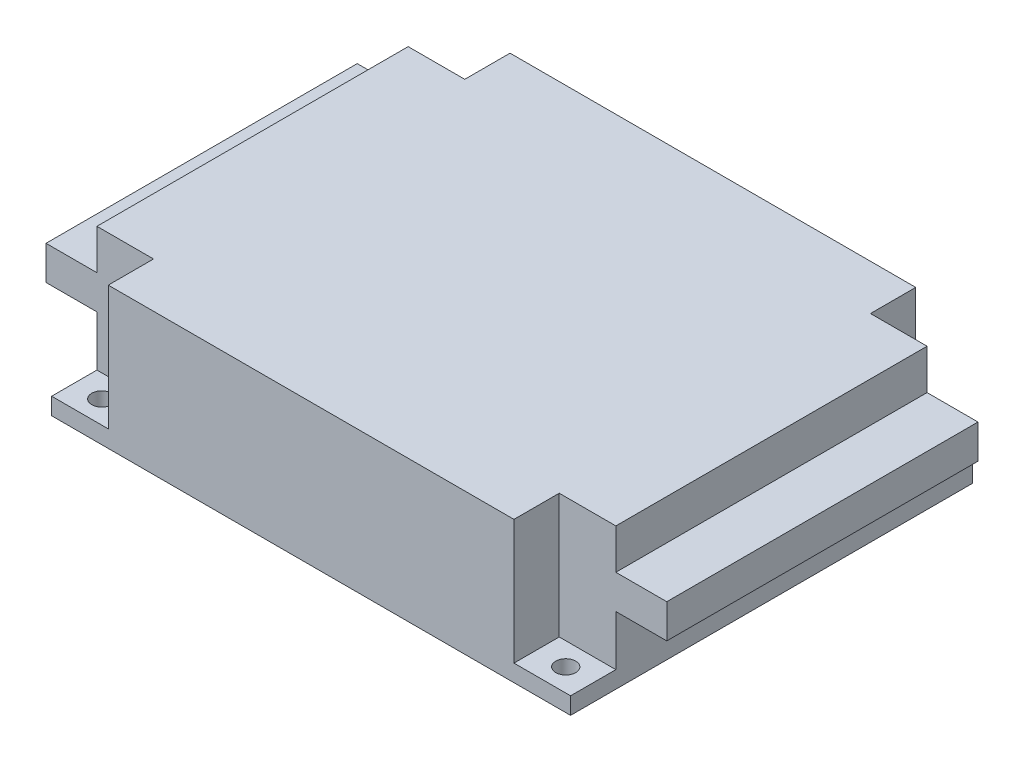
ISO-10303-21;
HEADER;
FILE_DESCRIPTION(('STEP AP214'),'2;1');
FILE_NAME('part.step','',(''),(''),'','','');
FILE_SCHEMA(('AUTOMOTIVE_DESIGN { 1 0 10303 214 1 1 1 1 }'));
ENDSEC;
DATA;
#1=APPLICATION_CONTEXT('core data for automotive mechanical design processes');
#2=APPLICATION_PROTOCOL_DEFINITION('international standard','automotive_design',2000,#1);
#3=PRODUCT_CONTEXT('',#1,'mechanical');
#4=PRODUCT('Part','Part','',(#3));
#5=PRODUCT_RELATED_PRODUCT_CATEGORY('part','',(#4));
#6=PRODUCT_DEFINITION_FORMATION('','',#4);
#7=PRODUCT_DEFINITION_CONTEXT('part definition',#1,'design');
#8=PRODUCT_DEFINITION('design','',#6,#7);
#9=PRODUCT_DEFINITION_SHAPE('','',#8);
#10=(LENGTH_UNIT() NAMED_UNIT(*) SI_UNIT(.MILLI.,.METRE.));
#11=(NAMED_UNIT(*) PLANE_ANGLE_UNIT() SI_UNIT($,.RADIAN.));
#12=(NAMED_UNIT(*) SI_UNIT($,.STERADIAN.) SOLID_ANGLE_UNIT());
#13=UNCERTAINTY_MEASURE_WITH_UNIT(LENGTH_MEASURE(1.E-05),#10,'distance_accuracy_value','');
#14=(GEOMETRIC_REPRESENTATION_CONTEXT(3) GLOBAL_UNCERTAINTY_ASSIGNED_CONTEXT((#13)) GLOBAL_UNIT_ASSIGNED_CONTEXT((#10,
#11,#12)) REPRESENTATION_CONTEXT('',''));
#15=CARTESIAN_POINT('',(0.,0.,0.));
#16=DIRECTION('',(0.,0.,1.));
#17=DIRECTION('',(1.,0.,0.));
#18=AXIS2_PLACEMENT_3D('',#15,#16,#17);
#19=CARTESIAN_POINT('',(0.,0.,0.));
#20=DIRECTION('',(0.,1.,0.));
#21=DIRECTION('',(0.,0.,1.));
#22=AXIS2_PLACEMENT_3D('',#19,#20,#21);
#23=PLANE('',#22);
#24=CARTESIAN_POINT('',(86.8463240658172,0.,-55.9996014014068));
#25=DIRECTION('',(0.,-1.,0.));
#26=DIRECTION('',(0.,0.,-1.));
#27=AXIS2_PLACEMENT_3D('',#24,#25,#26);
#28=CIRCLE('',#27,1.76559838278757);
#29=CARTESIAN_POINT('',(86.8463240658172,0.,-57.7651997841944));
#30=VERTEX_POINT('',#29);
#31=EDGE_CURVE('E713',#30,#30,#28,.T.);
#32=ORIENTED_EDGE('',*,*,#31,.F.);
#33=EDGE_LOOP('',(#32));
#34=FACE_BOUND('',#33,.T.);
#35=CARTESIAN_POINT('',(86.8463240658172,0.,6.99960140140685));
#36=DIRECTION('',(0.,-1.,0.));
#37=DIRECTION('',(0.,0.,-1.));
#38=AXIS2_PLACEMENT_3D('',#35,#36,#37);
#39=CIRCLE('',#38,1.76559838278757);
#40=CARTESIAN_POINT('',(86.8463240658172,0.,5.23400301861927));
#41=VERTEX_POINT('',#40);
#42=EDGE_CURVE('E363',#41,#41,#39,.T.);
#43=ORIENTED_EDGE('',*,*,#42,.F.);
#44=EDGE_LOOP('',(#43));
#45=FACE_BOUND('',#44,.T.);
#46=CARTESIAN_POINT('',(4.85367593418285,0.,6.99960140140685));
#47=DIRECTION('',(0.,-1.,0.));
#48=DIRECTION('',(0.,0.,-1.));
#49=AXIS2_PLACEMENT_3D('',#46,#47,#48);
#50=CIRCLE('',#49,1.76559838278757);
#51=CARTESIAN_POINT('',(4.85367593418285,0.,5.23400301861927));
#52=VERTEX_POINT('',#51);
#53=EDGE_CURVE('E352',#52,#52,#50,.T.);
#54=ORIENTED_EDGE('',*,*,#53,.F.);
#55=EDGE_LOOP('',(#54));
#56=FACE_BOUND('',#55,.T.);
#57=DIRECTION('',(0.,0.,-1.));
#58=VECTOR('',#57,1.);
#59=CARTESIAN_POINT('',(91.7,0.,11.));
#60=LINE('',#59,#58);
#61=CARTESIAN_POINT('',(91.7,0.,11.));
#62=VERTEX_POINT('',#61);
#63=CARTESIAN_POINT('',(91.7,0.,-60.));
#64=VERTEX_POINT('',#63);
#65=EDGE_CURVE('E317',#62,#64,#60,.T.);
#66=ORIENTED_EDGE('',*,*,#65,.F.);
#67=DIRECTION('',(1.,0.,0.));
#68=VECTOR('',#67,1.);
#69=CARTESIAN_POINT('',(0.,0.,11.));
#70=LINE('',#69,#68);
#71=CARTESIAN_POINT('',(0.,0.,11.));
#72=VERTEX_POINT('',#71);
#73=EDGE_CURVE('E327',#72,#62,#70,.T.);
#74=ORIENTED_EDGE('',*,*,#73,.F.);
#75=DIRECTION('',(0.,0.,1.));
#76=VECTOR('',#75,1.);
#77=CARTESIAN_POINT('',(0.,0.,-60.));
#78=LINE('',#77,#76);
#79=CARTESIAN_POINT('',(0.,0.,-60.));
#80=VERTEX_POINT('',#79);
#81=EDGE_CURVE('E324',#80,#72,#78,.T.);
#82=ORIENTED_EDGE('',*,*,#81,.F.);
#83=DIRECTION('',(-1.,0.,0.));
#84=VECTOR('',#83,1.);
#85=CARTESIAN_POINT('',(91.7,0.,-60.));
#86=LINE('',#85,#84);
#87=EDGE_CURVE('E320',#64,#80,#86,.T.);
#88=ORIENTED_EDGE('',*,*,#87,.F.);
#89=EDGE_LOOP('',(#66,#74,#82,#88));
#90=FACE_BOUND('',#89,.T.);
#91=CARTESIAN_POINT('',(4.85367593418285,0.,-55.9996014014068));
#92=DIRECTION('',(0.,-1.,0.));
#93=DIRECTION('',(0.,0.,-1.));
#94=AXIS2_PLACEMENT_3D('',#91,#92,#93);
#95=CIRCLE('',#94,1.76559838278757);
#96=CARTESIAN_POINT('',(4.85367593418285,0.,-57.7651997841944));
#97=VERTEX_POINT('',#96);
#98=EDGE_CURVE('E349',#97,#97,#95,.T.);
#99=ORIENTED_EDGE('',*,*,#98,.F.);
#100=EDGE_LOOP('',(#99));
#101=FACE_BOUND('',#100,.T.);
#102=ADVANCED_FACE('F36',(#34,#45,#56,#90,#101),#23,.F.);
#103=CARTESIAN_POINT('',(91.7,0.,11.));
#104=DIRECTION('',(1.,0.,0.));
#105=DIRECTION('',(0.,0.,-1.));
#106=AXIS2_PLACEMENT_3D('',#103,#104,#105);
#107=PLANE('',#106);
#108=DIRECTION('',(0.,1.,0.));
#109=VECTOR('',#108,1.);
#110=CARTESIAN_POINT('',(91.7,3.,2.99972961709421));
#111=LINE('',#110,#109);
#112=CARTESIAN_POINT('',(91.7,3.,2.99972961709421));
#113=VERTEX_POINT('',#112);
#114=CARTESIAN_POINT('',(91.7,11.9,2.99972961709421));
#115=VERTEX_POINT('',#114);
#116=EDGE_CURVE('E389',#113,#115,#111,.T.);
#117=ORIENTED_EDGE('',*,*,#116,.F.);
#118=DIRECTION('',(0.,0.,-1.));
#119=VECTOR('',#118,1.);
#120=CARTESIAN_POINT('',(91.7,3.,11.));
#121=LINE('',#120,#119);
#122=CARTESIAN_POINT('',(91.7,3.,11.));
#123=VERTEX_POINT('',#122);
#124=EDGE_CURVE('E384',#123,#113,#121,.T.);
#125=ORIENTED_EDGE('',*,*,#124,.F.);
#126=DIRECTION('',(0.,1.,0.));
#127=VECTOR('',#126,1.);
#128=CARTESIAN_POINT('',(91.7,0.,11.));
#129=LINE('',#128,#127);
#130=EDGE_CURVE('E333',#62,#123,#129,.T.);
#131=ORIENTED_EDGE('',*,*,#130,.F.);
#132=ORIENTED_EDGE('',*,*,#65,.T.);
#133=DIRECTION('',(0.,1.,0.));
#134=VECTOR('',#133,1.);
#135=CARTESIAN_POINT('',(91.7,0.,-60.));
#136=LINE('',#135,#134);
#137=CARTESIAN_POINT('',(91.7,3.,-60.));
#138=VERTEX_POINT('',#137);
#139=EDGE_CURVE('E330',#64,#138,#136,.T.);
#140=ORIENTED_EDGE('',*,*,#139,.T.);
#141=DIRECTION('',(0.,0.,-1.));
#142=VECTOR('',#141,1.);
#143=CARTESIAN_POINT('',(91.7,3.,-51.9997296170942));
#144=LINE('',#143,#142);
#145=CARTESIAN_POINT('',(91.7,3.,-51.9997296170942));
#146=VERTEX_POINT('',#145);
#147=EDGE_CURVE('E226',#146,#138,#144,.T.);
#148=ORIENTED_EDGE('',*,*,#147,.F.);
#149=DIRECTION('',(0.,-1.,0.));
#150=VECTOR('',#149,1.);
#151=CARTESIAN_POINT('',(91.7,25.,-51.9997296170942));
#152=LINE('',#151,#150);
#153=CARTESIAN_POINT('',(91.7,11.9,-51.9997296170942));
#154=VERTEX_POINT('',#153);
#155=EDGE_CURVE('E223',#154,#146,#152,.T.);
#156=ORIENTED_EDGE('',*,*,#155,.F.);
#157=DIRECTION('',(0.,0.,-1.));
#158=VECTOR('',#157,1.);
#159=CARTESIAN_POINT('',(91.7,11.9,-51.9997296170942));
#160=LINE('',#159,#158);
#161=EDGE_CURVE('E401',#115,#154,#160,.T.);
#162=ORIENTED_EDGE('',*,*,#161,.F.);
#163=EDGE_LOOP('',(#117,#125,#131,#132,#140,#148,#156,#162));
#164=FACE_BOUND('',#163,.T.);
#165=ADVANCED_FACE('F38',(#164),#107,.T.);
#166=CARTESIAN_POINT('',(0.,0.,11.));
#167=DIRECTION('',(0.,0.,1.));
#168=DIRECTION('',(1.,0.,0.));
#169=AXIS2_PLACEMENT_3D('',#166,#167,#168);
#170=PLANE('',#169);
#171=DIRECTION('',(1.,0.,0.));
#172=VECTOR('',#171,1.);
#173=CARTESIAN_POINT('',(81.6970766500701,3.,11.));
#174=LINE('',#173,#172);
#175=CARTESIAN_POINT('',(81.6970766500701,3.,11.));
#176=VERTEX_POINT('',#175);
#177=EDGE_CURVE('E395',#176,#123,#174,.T.);
#178=ORIENTED_EDGE('',*,*,#177,.F.);
#179=DIRECTION('',(0.,-1.,0.));
#180=VECTOR('',#179,1.);
#181=CARTESIAN_POINT('',(81.6970766500701,25.,11.));
#182=LINE('',#181,#180);
#183=CARTESIAN_POINT('',(81.6970766500701,25.,11.));
#184=VERTEX_POINT('',#183);
#185=EDGE_CURVE('E385',#184,#176,#182,.T.);
#186=ORIENTED_EDGE('',*,*,#185,.F.);
#187=DIRECTION('',(1.,0.,0.));
#188=VECTOR('',#187,1.);
#189=CARTESIAN_POINT('',(0.,25.,11.));
#190=LINE('',#189,#188);
#191=CARTESIAN_POINT('',(10.0029233499299,25.,11.));
#192=VERTEX_POINT('',#191);
#193=EDGE_CURVE('E321',#192,#184,#190,.T.);
#194=ORIENTED_EDGE('',*,*,#193,.F.);
#195=DIRECTION('',(0.,1.,0.));
#196=VECTOR('',#195,1.);
#197=CARTESIAN_POINT('',(10.0029233499299,3.,11.));
#198=LINE('',#197,#196);
#199=CARTESIAN_POINT('',(10.0029233499299,3.,11.));
#200=VERTEX_POINT('',#199);
#201=EDGE_CURVE('E264',#200,#192,#198,.T.);
#202=ORIENTED_EDGE('',*,*,#201,.F.);
#203=DIRECTION('',(-1.,0.,0.));
#204=VECTOR('',#203,1.);
#205=CARTESIAN_POINT('',(10.0029233499299,3.,11.));
#206=LINE('',#205,#204);
#207=CARTESIAN_POINT('',(0.,3.,11.));
#208=VERTEX_POINT('',#207);
#209=EDGE_CURVE('E269',#200,#208,#206,.T.);
#210=ORIENTED_EDGE('',*,*,#209,.T.);
#211=DIRECTION('',(0.,1.,0.));
#212=VECTOR('',#211,1.);
#213=CARTESIAN_POINT('',(0.,0.,11.));
#214=LINE('',#213,#212);
#215=EDGE_CURVE('E337',#72,#208,#214,.T.);
#216=ORIENTED_EDGE('',*,*,#215,.F.);
#217=ORIENTED_EDGE('',*,*,#73,.T.);
#218=ORIENTED_EDGE('',*,*,#130,.T.);
#219=EDGE_LOOP('',(#178,#186,#194,#202,#210,#216,#217,#218));
#220=FACE_BOUND('',#219,.T.);
#221=ADVANCED_FACE('F445',(#220),#170,.T.);
#222=CARTESIAN_POINT('',(0.,0.,-60.));
#223=DIRECTION('',(-1.,0.,0.));
#224=DIRECTION('',(0.,0.,1.));
#225=AXIS2_PLACEMENT_3D('',#222,#223,#224);
#226=PLANE('',#225);
#227=DIRECTION('',(0.,0.,1.));
#228=VECTOR('',#227,1.);
#229=CARTESIAN_POINT('',(0.,3.,2.99972961709421));
#230=LINE('',#229,#228);
#231=CARTESIAN_POINT('',(0.,3.,2.99972961709421));
#232=VERTEX_POINT('',#231);
#233=EDGE_CURVE('E258',#232,#208,#230,.T.);
#234=ORIENTED_EDGE('',*,*,#233,.F.);
#235=DIRECTION('',(0.,-1.,0.));
#236=VECTOR('',#235,1.);
#237=CARTESIAN_POINT('',(0.,25.,2.99972961709421));
#238=LINE('',#237,#236);
#239=CARTESIAN_POINT('',(0.,11.9,2.99972961709421));
#240=VERTEX_POINT('',#239);
#241=EDGE_CURVE('E248',#240,#232,#238,.T.);
#242=ORIENTED_EDGE('',*,*,#241,.F.);
#243=DIRECTION('',(0.,0.,1.));
#244=VECTOR('',#243,1.);
#245=CARTESIAN_POINT('',(0.,11.9,2.99972961709421));
#246=LINE('',#245,#244);
#247=CARTESIAN_POINT('',(0.,11.9,-51.9997296170942));
#248=VERTEX_POINT('',#247);
#249=EDGE_CURVE('E272',#248,#240,#246,.T.);
#250=ORIENTED_EDGE('',*,*,#249,.F.);
#251=DIRECTION('',(0.,1.,0.));
#252=VECTOR('',#251,1.);
#253=CARTESIAN_POINT('',(0.,3.,-51.9997296170942));
#254=LINE('',#253,#252);
#255=CARTESIAN_POINT('',(0.,3.,-51.9997296170942));
#256=VERTEX_POINT('',#255);
#257=EDGE_CURVE('E302',#256,#248,#254,.T.);
#258=ORIENTED_EDGE('',*,*,#257,.F.);
#259=DIRECTION('',(0.,0.,-1.));
#260=VECTOR('',#259,1.);
#261=CARTESIAN_POINT('',(0.,3.,-51.9997296170942));
#262=LINE('',#261,#260);
#263=CARTESIAN_POINT('',(0.,3.,-60.));
#264=VERTEX_POINT('',#263);
#265=EDGE_CURVE('E309',#256,#264,#262,.T.);
#266=ORIENTED_EDGE('',*,*,#265,.T.);
#267=DIRECTION('',(0.,1.,0.));
#268=VECTOR('',#267,1.);
#269=CARTESIAN_POINT('',(0.,0.,-60.));
#270=LINE('',#269,#268);
#271=EDGE_CURVE('E340',#80,#264,#270,.T.);
#272=ORIENTED_EDGE('',*,*,#271,.F.);
#273=ORIENTED_EDGE('',*,*,#81,.T.);
#274=ORIENTED_EDGE('',*,*,#215,.T.);
#275=EDGE_LOOP('',(#234,#242,#250,#258,#266,#272,#273,#274));
#276=FACE_BOUND('',#275,.T.);
#277=ADVANCED_FACE('F454',(#276),#226,.T.);
#278=CARTESIAN_POINT('',(91.7,0.,-60.));
#279=DIRECTION('',(0.,0.,-1.));
#280=DIRECTION('',(-1.,0.,0.));
#281=AXIS2_PLACEMENT_3D('',#278,#279,#280);
#282=PLANE('',#281);
#283=DIRECTION('',(1.,0.,0.));
#284=VECTOR('',#283,1.);
#285=CARTESIAN_POINT('',(81.6970766500701,3.,-60.));
#286=LINE('',#285,#284);
#287=CARTESIAN_POINT('',(81.6970766500701,3.,-60.));
#288=VERTEX_POINT('',#287);
#289=EDGE_CURVE('E249',#288,#138,#286,.T.);
#290=ORIENTED_EDGE('',*,*,#289,.T.);
#291=ORIENTED_EDGE('',*,*,#139,.F.);
#292=ORIENTED_EDGE('',*,*,#87,.T.);
#293=ORIENTED_EDGE('',*,*,#271,.T.);
#294=DIRECTION('',(-1.,0.,0.));
#295=VECTOR('',#294,1.);
#296=CARTESIAN_POINT('',(10.0029233499299,3.,-60.));
#297=LINE('',#296,#295);
#298=CARTESIAN_POINT('',(10.0029233499299,3.,-60.));
#299=VERTEX_POINT('',#298);
#300=EDGE_CURVE('E296',#299,#264,#297,.T.);
#301=ORIENTED_EDGE('',*,*,#300,.F.);
#302=DIRECTION('',(0.,-1.,0.));
#303=VECTOR('',#302,1.);
#304=CARTESIAN_POINT('',(10.0029233499299,25.,-60.));
#305=LINE('',#304,#303);
#306=CARTESIAN_POINT('',(10.0029233499299,25.,-60.));
#307=VERTEX_POINT('',#306);
#308=EDGE_CURVE('E292',#307,#299,#305,.T.);
#309=ORIENTED_EDGE('',*,*,#308,.F.);
#310=DIRECTION('',(-1.,0.,0.));
#311=VECTOR('',#310,1.);
#312=CARTESIAN_POINT('',(91.7,25.,-60.));
#313=LINE('',#312,#311);
#314=CARTESIAN_POINT('',(81.6970766500701,25.,-60.));
#315=VERTEX_POINT('',#314);
#316=EDGE_CURVE('E312',#315,#307,#313,.T.);
#317=ORIENTED_EDGE('',*,*,#316,.F.);
#318=DIRECTION('',(0.,1.,0.));
#319=VECTOR('',#318,1.);
#320=CARTESIAN_POINT('',(81.6970766500701,3.,-60.));
#321=LINE('',#320,#319);
#322=EDGE_CURVE('E239',#288,#315,#321,.T.);
#323=ORIENTED_EDGE('',*,*,#322,.F.);
#324=EDGE_LOOP('',(#290,#291,#292,#293,#301,#309,#317,#323));
#325=FACE_BOUND('',#324,.T.);
#326=ADVANCED_FACE('F430',(#325),#282,.T.);
#327=CARTESIAN_POINT('',(0.,25.,0.));
#328=DIRECTION('',(0.,1.,0.));
#329=DIRECTION('',(0.,0.,1.));
#330=AXIS2_PLACEMENT_3D('',#327,#328,#329);
#331=PLANE('',#330);
#332=DIRECTION('',(0.,0.,1.));
#333=VECTOR('',#332,1.);
#334=CARTESIAN_POINT('',(91.7,25.,-60.));
#335=LINE('',#334,#333);
#336=CARTESIAN_POINT('',(91.7,25.,-51.9997296170942));
#337=VERTEX_POINT('',#336);
#338=CARTESIAN_POINT('',(91.7,25.,2.99972961709421));
#339=VERTEX_POINT('',#338);
#340=EDGE_CURVE('E198',#337,#339,#335,.T.);
#341=ORIENTED_EDGE('',*,*,#340,.F.);
#342=DIRECTION('',(1.,0.,0.));
#343=VECTOR('',#342,1.);
#344=CARTESIAN_POINT('',(81.6970766500701,25.,-51.9997296170942));
#345=LINE('',#344,#343);
#346=CARTESIAN_POINT('',(81.6970766500701,25.,-51.9997296170942));
#347=VERTEX_POINT('',#346);
#348=EDGE_CURVE('E246',#347,#337,#345,.T.);
#349=ORIENTED_EDGE('',*,*,#348,.F.);
#350=DIRECTION('',(0.,0.,1.));
#351=VECTOR('',#350,1.);
#352=CARTESIAN_POINT('',(81.6970766500701,25.,-60.));
#353=LINE('',#352,#351);
#354=EDGE_CURVE('E241',#315,#347,#353,.T.);
#355=ORIENTED_EDGE('',*,*,#354,.F.);
#356=ORIENTED_EDGE('',*,*,#316,.T.);
#357=DIRECTION('',(0.,0.,-1.));
#358=VECTOR('',#357,1.);
#359=CARTESIAN_POINT('',(10.0029233499299,25.,-51.9997296170942));
#360=LINE('',#359,#358);
#361=CARTESIAN_POINT('',(10.0029233499299,25.,-51.9997296170942));
#362=VERTEX_POINT('',#361);
#363=EDGE_CURVE('E305',#362,#307,#360,.T.);
#364=ORIENTED_EDGE('',*,*,#363,.F.);
#365=DIRECTION('',(1.,0.,0.));
#366=VECTOR('',#365,1.);
#367=CARTESIAN_POINT('',(0.,25.,-51.9997296170942));
#368=LINE('',#367,#366);
#369=CARTESIAN_POINT('',(0.,25.,-51.9997296170942));
#370=VERTEX_POINT('',#369);
#371=EDGE_CURVE('E293',#370,#362,#368,.T.);
#372=ORIENTED_EDGE('',*,*,#371,.F.);
#373=DIRECTION('',(0.,0.,-1.));
#374=VECTOR('',#373,1.);
#375=CARTESIAN_POINT('',(0.,25.,11.));
#376=LINE('',#375,#374);
#377=CARTESIAN_POINT('',(0.,25.,2.99972961709421));
#378=VERTEX_POINT('',#377);
#379=EDGE_CURVE('E377',#378,#370,#376,.T.);
#380=ORIENTED_EDGE('',*,*,#379,.F.);
#381=DIRECTION('',(1.,0.,0.));
#382=VECTOR('',#381,1.);
#383=CARTESIAN_POINT('',(-9.,25.,2.99972961709421));
#384=LINE('',#383,#382);
#385=CARTESIAN_POINT('',(10.0029233499299,25.,2.99972961709421));
#386=VERTEX_POINT('',#385);
#387=EDGE_CURVE('E282',#378,#386,#384,.T.);
#388=ORIENTED_EDGE('',*,*,#387,.T.);
#389=DIRECTION('',(0.,0.,-1.));
#390=VECTOR('',#389,1.);
#391=CARTESIAN_POINT('',(10.0029233499299,25.,11.));
#392=LINE('',#391,#390);
#393=EDGE_CURVE('E254',#192,#386,#392,.T.);
#394=ORIENTED_EDGE('',*,*,#393,.F.);
#395=ORIENTED_EDGE('',*,*,#193,.T.);
#396=DIRECTION('',(0.,0.,1.));
#397=VECTOR('',#396,1.);
#398=CARTESIAN_POINT('',(81.6970766500701,25.,2.99972961709421));
#399=LINE('',#398,#397);
#400=CARTESIAN_POINT('',(81.6970766500701,25.,2.99972961709421));
#401=VERTEX_POINT('',#400);
#402=EDGE_CURVE('E222',#401,#184,#399,.T.);
#403=ORIENTED_EDGE('',*,*,#402,.F.);
#404=DIRECTION('',(-1.,0.,0.));
#405=VECTOR('',#404,1.);
#406=CARTESIAN_POINT('',(100.7,25.,2.99972961709421));
#407=LINE('',#406,#405);
#408=EDGE_CURVE('E215',#339,#401,#407,.T.);
#409=ORIENTED_EDGE('',*,*,#408,.F.);
#410=EDGE_LOOP('',(#341,#349,#355,#356,#364,#372,#380,#388,#394,#395,#403,#409));
#411=FACE_BOUND('',#410,.T.);
#412=ADVANCED_FACE('F220',(#411),#331,.T.);
#413=CARTESIAN_POINT('',(10.0029233499299,3.,-51.9997296170942));
#414=DIRECTION('',(0.,-1.,0.));
#415=DIRECTION('',(0.,0.,-1.));
#416=AXIS2_PLACEMENT_3D('',#413,#414,#415);
#417=PLANE('',#416);
#418=CARTESIAN_POINT('',(4.85367593418285,3.,-55.9996014014068));
#419=DIRECTION('',(0.,-1.,0.));
#420=DIRECTION('',(0.,0.,-1.));
#421=AXIS2_PLACEMENT_3D('',#418,#419,#420);
#422=CIRCLE('',#421,1.76559838278757);
#423=CARTESIAN_POINT('',(4.85367593418285,3.,-57.7651997841944));
#424=VERTEX_POINT('',#423);
#425=EDGE_CURVE('E217',#424,#424,#422,.T.);
#426=ORIENTED_EDGE('',*,*,#425,.T.);
#427=EDGE_LOOP('',(#426));
#428=FACE_BOUND('',#427,.T.);
#429=ORIENTED_EDGE('',*,*,#300,.T.);
#430=ORIENTED_EDGE('',*,*,#265,.F.);
#431=DIRECTION('',(-1.,0.,0.));
#432=VECTOR('',#431,1.);
#433=CARTESIAN_POINT('',(10.0029233499299,3.,-51.9997296170942));
#434=LINE('',#433,#432);
#435=CARTESIAN_POINT('',(10.0029233499299,3.,-51.9997296170942));
#436=VERTEX_POINT('',#435);
#437=EDGE_CURVE('E299',#436,#256,#434,.T.);
#438=ORIENTED_EDGE('',*,*,#437,.F.);
#439=DIRECTION('',(0.,0.,-1.));
#440=VECTOR('',#439,1.);
#441=CARTESIAN_POINT('',(10.0029233499299,3.,-51.9997296170942));
#442=LINE('',#441,#440);
#443=EDGE_CURVE('E313',#436,#299,#442,.T.);
#444=ORIENTED_EDGE('',*,*,#443,.T.);
#445=EDGE_LOOP('',(#429,#430,#438,#444));
#446=FACE_BOUND('',#445,.T.);
#447=ADVANCED_FACE('F458',(#428,#446),#417,.F.);
#448=CARTESIAN_POINT('',(10.0029233499299,25.,-51.9997296170942));
#449=DIRECTION('',(1.,0.,0.));
#450=DIRECTION('',(0.,0.,-1.));
#451=AXIS2_PLACEMENT_3D('',#448,#449,#450);
#452=PLANE('',#451);
#453=ORIENTED_EDGE('',*,*,#308,.T.);
#454=ORIENTED_EDGE('',*,*,#443,.F.);
#455=DIRECTION('',(0.,-1.,0.));
#456=VECTOR('',#455,1.);
#457=CARTESIAN_POINT('',(10.0029233499299,25.,-51.9997296170942));
#458=LINE('',#457,#456);
#459=EDGE_CURVE('E295',#362,#436,#458,.T.);
#460=ORIENTED_EDGE('',*,*,#459,.F.);
#461=ORIENTED_EDGE('',*,*,#363,.T.);
#462=EDGE_LOOP('',(#453,#454,#460,#461));
#463=FACE_BOUND('',#462,.T.);
#464=ADVANCED_FACE('F466',(#463),#452,.F.);
#465=CARTESIAN_POINT('',(0.,0.,-51.9997296170942));
#466=DIRECTION('',(0.,0.,-1.));
#467=DIRECTION('',(-1.,0.,0.));
#468=AXIS2_PLACEMENT_3D('',#465,#466,#467);
#469=PLANE('',#468);
#470=DIRECTION('',(-1.,0.,0.));
#471=VECTOR('',#470,1.);
#472=CARTESIAN_POINT('',(0.,17.9,-51.9997296170942));
#473=LINE('',#472,#471);
#474=CARTESIAN_POINT('',(0.,17.9,-51.9997296170942));
#475=VERTEX_POINT('',#474);
#476=CARTESIAN_POINT('',(-9.,17.9,-51.9997296170942));
#477=VERTEX_POINT('',#476);
#478=EDGE_CURVE('E60',#475,#477,#473,.T.);
#479=ORIENTED_EDGE('',*,*,#478,.F.);
#480=DIRECTION('',(0.,-1.,0.));
#481=VECTOR('',#480,1.);
#482=CARTESIAN_POINT('',(0.,25.,-51.9997296170942));
#483=LINE('',#482,#481);
#484=EDGE_CURVE('E373',#370,#475,#483,.T.);
#485=ORIENTED_EDGE('',*,*,#484,.F.);
#486=ORIENTED_EDGE('',*,*,#371,.T.);
#487=ORIENTED_EDGE('',*,*,#459,.T.);
#488=ORIENTED_EDGE('',*,*,#437,.T.);
#489=ORIENTED_EDGE('',*,*,#257,.T.);
#490=DIRECTION('',(1.,0.,0.));
#491=VECTOR('',#490,1.);
#492=CARTESIAN_POINT('',(-9.,11.9,-51.9997296170942));
#493=LINE('',#492,#491);
#494=CARTESIAN_POINT('',(-9.,11.9,-51.9997296170942));
#495=VERTEX_POINT('',#494);
#496=EDGE_CURVE('E289',#495,#248,#493,.T.);
#497=ORIENTED_EDGE('',*,*,#496,.F.);
#498=DIRECTION('',(0.,-1.,0.));
#499=VECTOR('',#498,1.);
#500=CARTESIAN_POINT('',(-9.,11.9,-51.9997296170942));
#501=LINE('',#500,#499);
#502=EDGE_CURVE('E275',#477,#495,#501,.T.);
#503=ORIENTED_EDGE('',*,*,#502,.F.);
#504=EDGE_LOOP('',(#479,#485,#486,#487,#488,#489,#497,#503));
#505=FACE_BOUND('',#504,.T.);
#506=ADVANCED_FACE('F460',(#505),#469,.T.);
#507=CARTESIAN_POINT('',(-9.,11.9,2.99972961709421));
#508=DIRECTION('',(0.,1.,0.));
#509=DIRECTION('',(0.,0.,1.));
#510=AXIS2_PLACEMENT_3D('',#507,#508,#509);
#511=PLANE('',#510);
#512=ORIENTED_EDGE('',*,*,#249,.T.);
#513=DIRECTION('',(1.,0.,0.));
#514=VECTOR('',#513,1.);
#515=CARTESIAN_POINT('',(-9.,11.9,2.99972961709421));
#516=LINE('',#515,#514);
#517=CARTESIAN_POINT('',(-9.,11.9,2.99972961709421));
#518=VERTEX_POINT('',#517);
#519=EDGE_CURVE('E286',#518,#240,#516,.T.);
#520=ORIENTED_EDGE('',*,*,#519,.F.);
#521=DIRECTION('',(0.,0.,1.));
#522=VECTOR('',#521,1.);
#523=CARTESIAN_POINT('',(-9.,11.9,2.99972961709421));
#524=LINE('',#523,#522);
#525=EDGE_CURVE('E277',#495,#518,#524,.T.);
#526=ORIENTED_EDGE('',*,*,#525,.F.);
#527=ORIENTED_EDGE('',*,*,#496,.T.);
#528=EDGE_LOOP('',(#512,#520,#526,#527));
#529=FACE_BOUND('',#528,.T.);
#530=ADVANCED_FACE('F539',(#529),#511,.F.);
#531=CARTESIAN_POINT('',(-9.,25.,2.99972961709421));
#532=DIRECTION('',(0.,0.,-1.));
#533=DIRECTION('',(0.,1.,0.));
#534=AXIS2_PLACEMENT_3D('',#531,#532,#533);
#535=PLANE('',#534);
#536=DIRECTION('',(0.,-1.,0.));
#537=VECTOR('',#536,1.);
#538=CARTESIAN_POINT('',(0.,25.,2.99972961709421));
#539=LINE('',#538,#537);
#540=CARTESIAN_POINT('',(0.,17.9,2.99972961709421));
#541=VERTEX_POINT('',#540);
#542=EDGE_CURVE('E45',#378,#541,#539,.T.);
#543=ORIENTED_EDGE('',*,*,#542,.T.);
#544=DIRECTION('',(-1.,0.,0.));
#545=VECTOR('',#544,1.);
#546=CARTESIAN_POINT('',(-9.,17.9,2.99972961709421));
#547=LINE('',#546,#545);
#548=CARTESIAN_POINT('',(-9.,17.9,2.99972961709421));
#549=VERTEX_POINT('',#548);
#550=EDGE_CURVE('E380',#541,#549,#547,.T.);
#551=ORIENTED_EDGE('',*,*,#550,.T.);
#552=DIRECTION('',(0.,1.,0.));
#553=VECTOR('',#552,1.);
#554=CARTESIAN_POINT('',(-9.,25.,2.99972961709421));
#555=LINE('',#554,#553);
#556=EDGE_CURVE('E279',#518,#549,#555,.T.);
#557=ORIENTED_EDGE('',*,*,#556,.F.);
#558=ORIENTED_EDGE('',*,*,#519,.T.);
#559=ORIENTED_EDGE('',*,*,#241,.T.);
#560=DIRECTION('',(-1.,0.,0.));
#561=VECTOR('',#560,1.);
#562=CARTESIAN_POINT('',(10.0029233499299,3.,2.99972961709421));
#563=LINE('',#562,#561);
#564=CARTESIAN_POINT('',(10.0029233499299,3.,2.99972961709421));
#565=VERTEX_POINT('',#564);
#566=EDGE_CURVE('E266',#565,#232,#563,.T.);
#567=ORIENTED_EDGE('',*,*,#566,.F.);
#568=DIRECTION('',(0.,-1.,0.));
#569=VECTOR('',#568,1.);
#570=CARTESIAN_POINT('',(10.0029233499299,25.,2.99972961709421));
#571=LINE('',#570,#569);
#572=EDGE_CURVE('E257',#386,#565,#571,.T.);
#573=ORIENTED_EDGE('',*,*,#572,.F.);
#574=ORIENTED_EDGE('',*,*,#387,.F.);
#575=EDGE_LOOP('',(#543,#551,#557,#558,#559,#567,#573,#574));
#576=FACE_BOUND('',#575,.T.);
#577=ADVANCED_FACE('F473',(#576),#535,.F.);
#578=CARTESIAN_POINT('',(-9.,0.,0.));
#579=DIRECTION('',(1.,0.,0.));
#580=DIRECTION('',(0.,0.,-1.));
#581=AXIS2_PLACEMENT_3D('',#578,#579,#580);
#582=PLANE('',#581);
#583=ORIENTED_EDGE('',*,*,#556,.T.);
#584=DIRECTION('',(0.,0.,-1.));
#585=VECTOR('',#584,1.);
#586=CARTESIAN_POINT('',(-9.,17.9,0.));
#587=LINE('',#586,#585);
#588=EDGE_CURVE('E336',#549,#477,#587,.T.);
#589=ORIENTED_EDGE('',*,*,#588,.T.);
#590=ORIENTED_EDGE('',*,*,#502,.T.);
#591=ORIENTED_EDGE('',*,*,#525,.T.);
#592=EDGE_LOOP('',(#583,#589,#590,#591));
#593=FACE_BOUND('',#592,.T.);
#594=ADVANCED_FACE('F555',(#593),#582,.F.);
#595=CARTESIAN_POINT('',(10.0029233499299,3.,2.99972961709421));
#596=DIRECTION('',(0.,-1.,0.));
#597=DIRECTION('',(0.,0.,-1.));
#598=AXIS2_PLACEMENT_3D('',#595,#596,#597);
#599=PLANE('',#598);
#600=CARTESIAN_POINT('',(4.85367593418285,3.,6.99960140140685));
#601=DIRECTION('',(0.,-1.,0.));
#602=DIRECTION('',(0.,0.,-1.));
#603=AXIS2_PLACEMENT_3D('',#600,#601,#602);
#604=CIRCLE('',#603,1.76559838278757);
#605=CARTESIAN_POINT('',(4.85367593418285,3.,5.23400301861927));
#606=VERTEX_POINT('',#605);
#607=EDGE_CURVE('E350',#606,#606,#604,.T.);
#608=ORIENTED_EDGE('',*,*,#607,.T.);
#609=EDGE_LOOP('',(#608));
#610=FACE_BOUND('',#609,.T.);
#611=ORIENTED_EDGE('',*,*,#233,.T.);
#612=ORIENTED_EDGE('',*,*,#209,.F.);
#613=DIRECTION('',(0.,0.,1.));
#614=VECTOR('',#613,1.);
#615=CARTESIAN_POINT('',(10.0029233499299,3.,2.99972961709421));
#616=LINE('',#615,#614);
#617=EDGE_CURVE('E261',#565,#200,#616,.T.);
#618=ORIENTED_EDGE('',*,*,#617,.F.);
#619=ORIENTED_EDGE('',*,*,#566,.T.);
#620=EDGE_LOOP('',(#611,#612,#618,#619));
#621=FACE_BOUND('',#620,.T.);
#622=ADVANCED_FACE('F562',(#610,#621),#599,.F.);
#623=CARTESIAN_POINT('',(10.0029233499299,0.,0.));
#624=DIRECTION('',(-1.,0.,0.));
#625=DIRECTION('',(0.,0.,1.));
#626=AXIS2_PLACEMENT_3D('',#623,#624,#625);
#627=PLANE('',#626);
#628=ORIENTED_EDGE('',*,*,#393,.T.);
#629=ORIENTED_EDGE('',*,*,#572,.T.);
#630=ORIENTED_EDGE('',*,*,#617,.T.);
#631=ORIENTED_EDGE('',*,*,#201,.T.);
#632=EDGE_LOOP('',(#628,#629,#630,#631));
#633=FACE_BOUND('',#632,.T.);
#634=ADVANCED_FACE('F476',(#633),#627,.T.);
#635=CARTESIAN_POINT('',(81.6970766500701,25.,-51.9997296170942));
#636=DIRECTION('',(0.,0.,1.));
#637=DIRECTION('',(1.,0.,0.));
#638=AXIS2_PLACEMENT_3D('',#635,#636,#637);
#639=PLANE('',#638);
#640=DIRECTION('',(0.,-1.,0.));
#641=VECTOR('',#640,1.);
#642=CARTESIAN_POINT('',(91.7,25.,-51.9997296170942));
#643=LINE('',#642,#641);
#644=CARTESIAN_POINT('',(91.7,17.9,-51.9997296170942));
#645=VERTEX_POINT('',#644);
#646=EDGE_CURVE('E204',#337,#645,#643,.T.);
#647=ORIENTED_EDGE('',*,*,#646,.T.);
#648=DIRECTION('',(1.,0.,0.));
#649=VECTOR('',#648,1.);
#650=CARTESIAN_POINT('',(81.6970766500701,17.9,-51.9997296170942));
#651=LINE('',#650,#649);
#652=CARTESIAN_POINT('',(100.7,17.9,-51.9997296170942));
#653=VERTEX_POINT('',#652);
#654=EDGE_CURVE('E368',#645,#653,#651,.T.);
#655=ORIENTED_EDGE('',*,*,#654,.T.);
#656=DIRECTION('',(0.,1.,0.));
#657=VECTOR('',#656,1.);
#658=CARTESIAN_POINT('',(100.7,25.,-51.9997296170942));
#659=LINE('',#658,#657);
#660=CARTESIAN_POINT('',(100.7,11.9,-51.9997296170942));
#661=VERTEX_POINT('',#660);
#662=EDGE_CURVE('E403',#661,#653,#659,.T.);
#663=ORIENTED_EDGE('',*,*,#662,.F.);
#664=DIRECTION('',(-1.,0.,0.));
#665=VECTOR('',#664,1.);
#666=CARTESIAN_POINT('',(100.7,11.9,-51.9997296170942));
#667=LINE('',#666,#665);
#668=EDGE_CURVE('E229',#661,#154,#667,.T.);
#669=ORIENTED_EDGE('',*,*,#668,.T.);
#670=ORIENTED_EDGE('',*,*,#155,.T.);
#671=DIRECTION('',(1.,0.,0.));
#672=VECTOR('',#671,1.);
#673=CARTESIAN_POINT('',(81.6970766500701,3.,-51.9997296170942));
#674=LINE('',#673,#672);
#675=CARTESIAN_POINT('',(81.6970766500701,3.,-51.9997296170942));
#676=VERTEX_POINT('',#675);
#677=EDGE_CURVE('E243',#676,#146,#674,.T.);
#678=ORIENTED_EDGE('',*,*,#677,.F.);
#679=DIRECTION('',(0.,-1.,0.));
#680=VECTOR('',#679,1.);
#681=CARTESIAN_POINT('',(81.6970766500701,25.,-51.9997296170942));
#682=LINE('',#681,#680);
#683=EDGE_CURVE('E233',#347,#676,#682,.T.);
#684=ORIENTED_EDGE('',*,*,#683,.F.);
#685=ORIENTED_EDGE('',*,*,#348,.T.);
#686=EDGE_LOOP('',(#647,#655,#663,#669,#670,#678,#684,#685));
#687=FACE_BOUND('',#686,.T.);
#688=ADVANCED_FACE('F415',(#687),#639,.F.);
#689=CARTESIAN_POINT('',(81.6970766500701,3.,-51.9997296170942));
#690=DIRECTION('',(0.,-1.,0.));
#691=DIRECTION('',(0.,0.,-1.));
#692=AXIS2_PLACEMENT_3D('',#689,#690,#691);
#693=PLANE('',#692);
#694=CARTESIAN_POINT('',(86.8463240658172,3.,-55.9996014014068));
#695=DIRECTION('',(0.,-1.,0.));
#696=DIRECTION('',(0.,0.,-1.));
#697=AXIS2_PLACEMENT_3D('',#694,#695,#696);
#698=CIRCLE('',#697,1.76559838278757);
#699=CARTESIAN_POINT('',(86.8463240658172,3.,-57.7651997841944));
#700=VERTEX_POINT('',#699);
#701=EDGE_CURVE('E40',#700,#700,#698,.T.);
#702=ORIENTED_EDGE('',*,*,#701,.T.);
#703=EDGE_LOOP('',(#702));
#704=FACE_BOUND('',#703,.T.);
#705=ORIENTED_EDGE('',*,*,#147,.T.);
#706=ORIENTED_EDGE('',*,*,#289,.F.);
#707=DIRECTION('',(0.,0.,-1.));
#708=VECTOR('',#707,1.);
#709=CARTESIAN_POINT('',(81.6970766500701,3.,-51.9997296170942));
#710=LINE('',#709,#708);
#711=EDGE_CURVE('E236',#676,#288,#710,.T.);
#712=ORIENTED_EDGE('',*,*,#711,.F.);
#713=ORIENTED_EDGE('',*,*,#677,.T.);
#714=EDGE_LOOP('',(#705,#706,#712,#713));
#715=FACE_BOUND('',#714,.T.);
#716=ADVANCED_FACE('F426',(#704,#715),#693,.F.);
#717=CARTESIAN_POINT('',(81.6970766500701,0.,0.));
#718=DIRECTION('',(1.,0.,0.));
#719=DIRECTION('',(0.,0.,-1.));
#720=AXIS2_PLACEMENT_3D('',#717,#718,#719);
#721=PLANE('',#720);
#722=ORIENTED_EDGE('',*,*,#683,.T.);
#723=ORIENTED_EDGE('',*,*,#711,.T.);
#724=ORIENTED_EDGE('',*,*,#322,.T.);
#725=ORIENTED_EDGE('',*,*,#354,.T.);
#726=EDGE_LOOP('',(#722,#723,#724,#725));
#727=FACE_BOUND('',#726,.T.);
#728=ADVANCED_FACE('F436',(#727),#721,.T.);
#729=CARTESIAN_POINT('',(100.7,11.9,2.99972961709421));
#730=DIRECTION('',(0.,0.,-1.));
#731=DIRECTION('',(0.,1.,0.));
#732=AXIS2_PLACEMENT_3D('',#729,#730,#731);
#733=PLANE('',#732);
#734=DIRECTION('',(0.,-1.,0.));
#735=VECTOR('',#734,1.);
#736=CARTESIAN_POINT('',(100.7,11.9,2.99972961709421));
#737=LINE('',#736,#735);
#738=CARTESIAN_POINT('',(100.7,17.9,2.99972961709421));
#739=VERTEX_POINT('',#738);
#740=CARTESIAN_POINT('',(100.7,11.9,2.99972961709421));
#741=VERTEX_POINT('',#740);
#742=EDGE_CURVE('E406',#739,#741,#737,.T.);
#743=ORIENTED_EDGE('',*,*,#742,.F.);
#744=DIRECTION('',(1.,0.,0.));
#745=VECTOR('',#744,1.);
#746=CARTESIAN_POINT('',(91.7,17.9,2.99972961709421));
#747=LINE('',#746,#745);
#748=CARTESIAN_POINT('',(91.7,17.9,2.99972961709421));
#749=VERTEX_POINT('',#748);
#750=EDGE_CURVE('E53',#749,#739,#747,.T.);
#751=ORIENTED_EDGE('',*,*,#750,.F.);
#752=DIRECTION('',(0.,-1.,0.));
#753=VECTOR('',#752,1.);
#754=CARTESIAN_POINT('',(91.7,25.,2.99972961709421));
#755=LINE('',#754,#753);
#756=EDGE_CURVE('E202',#339,#749,#755,.T.);
#757=ORIENTED_EDGE('',*,*,#756,.F.);
#758=ORIENTED_EDGE('',*,*,#408,.T.);
#759=DIRECTION('',(0.,1.,0.));
#760=VECTOR('',#759,1.);
#761=CARTESIAN_POINT('',(81.6970766500701,3.,2.99972961709421));
#762=LINE('',#761,#760);
#763=CARTESIAN_POINT('',(81.6970766500701,3.,2.99972961709421));
#764=VERTEX_POINT('',#763);
#765=EDGE_CURVE('E392',#764,#401,#762,.T.);
#766=ORIENTED_EDGE('',*,*,#765,.F.);
#767=DIRECTION('',(1.,0.,0.));
#768=VECTOR('',#767,1.);
#769=CARTESIAN_POINT('',(81.6970766500701,3.,2.99972961709421));
#770=LINE('',#769,#768);
#771=EDGE_CURVE('E399',#764,#113,#770,.T.);
#772=ORIENTED_EDGE('',*,*,#771,.T.);
#773=ORIENTED_EDGE('',*,*,#116,.T.);
#774=DIRECTION('',(-1.,0.,0.));
#775=VECTOR('',#774,1.);
#776=CARTESIAN_POINT('',(100.7,11.9,2.99972961709421));
#777=LINE('',#776,#775);
#778=EDGE_CURVE('E224',#741,#115,#777,.T.);
#779=ORIENTED_EDGE('',*,*,#778,.F.);
#780=EDGE_LOOP('',(#743,#751,#757,#758,#766,#772,#773,#779));
#781=FACE_BOUND('',#780,.T.);
#782=ADVANCED_FACE('F213',(#781),#733,.F.);
#783=CARTESIAN_POINT('',(100.7,11.9,-51.9997296170942));
#784=DIRECTION('',(0.,1.,0.));
#785=DIRECTION('',(0.,0.,1.));
#786=AXIS2_PLACEMENT_3D('',#783,#784,#785);
#787=PLANE('',#786);
#788=ORIENTED_EDGE('',*,*,#161,.T.);
#789=ORIENTED_EDGE('',*,*,#668,.F.);
#790=DIRECTION('',(0.,0.,-1.));
#791=VECTOR('',#790,1.);
#792=CARTESIAN_POINT('',(100.7,11.9,-51.9997296170942));
#793=LINE('',#792,#791);
#794=EDGE_CURVE('E408',#741,#661,#793,.T.);
#795=ORIENTED_EDGE('',*,*,#794,.F.);
#796=ORIENTED_EDGE('',*,*,#778,.T.);
#797=EDGE_LOOP('',(#788,#789,#795,#796));
#798=FACE_BOUND('',#797,.T.);
#799=ADVANCED_FACE('F418',(#798),#787,.F.);
#800=CARTESIAN_POINT('',(100.7,0.,0.));
#801=DIRECTION('',(-1.,0.,0.));
#802=DIRECTION('',(0.,0.,1.));
#803=AXIS2_PLACEMENT_3D('',#800,#801,#802);
#804=PLANE('',#803);
#805=ORIENTED_EDGE('',*,*,#662,.T.);
#806=DIRECTION('',(0.,0.,1.));
#807=VECTOR('',#806,1.);
#808=CARTESIAN_POINT('',(100.7,17.9,0.));
#809=LINE('',#808,#807);
#810=EDGE_CURVE('E11',#653,#739,#809,.T.);
#811=ORIENTED_EDGE('',*,*,#810,.T.);
#812=ORIENTED_EDGE('',*,*,#742,.T.);
#813=ORIENTED_EDGE('',*,*,#794,.T.);
#814=EDGE_LOOP('',(#805,#811,#812,#813));
#815=FACE_BOUND('',#814,.T.);
#816=ADVANCED_FACE('F439',(#815),#804,.F.);
#817=CARTESIAN_POINT('',(81.6970766500701,3.,11.));
#818=DIRECTION('',(0.,-1.,0.));
#819=DIRECTION('',(0.,0.,-1.));
#820=AXIS2_PLACEMENT_3D('',#817,#818,#819);
#821=PLANE('',#820);
#822=CARTESIAN_POINT('',(86.8463240658172,3.,6.99960140140685));
#823=DIRECTION('',(0.,-1.,0.));
#824=DIRECTION('',(0.,0.,-1.));
#825=AXIS2_PLACEMENT_3D('',#822,#823,#824);
#826=CIRCLE('',#825,1.76559838278757);
#827=CARTESIAN_POINT('',(86.8463240658172,3.,5.23400301861927));
#828=VERTEX_POINT('',#827);
#829=EDGE_CURVE('E358',#828,#828,#826,.T.);
#830=ORIENTED_EDGE('',*,*,#829,.T.);
#831=EDGE_LOOP('',(#830));
#832=FACE_BOUND('',#831,.T.);
#833=ORIENTED_EDGE('',*,*,#124,.T.);
#834=ORIENTED_EDGE('',*,*,#771,.F.);
#835=DIRECTION('',(0.,0.,-1.));
#836=VECTOR('',#835,1.);
#837=CARTESIAN_POINT('',(81.6970766500701,3.,11.));
#838=LINE('',#837,#836);
#839=EDGE_CURVE('E388',#176,#764,#838,.T.);
#840=ORIENTED_EDGE('',*,*,#839,.F.);
#841=ORIENTED_EDGE('',*,*,#177,.T.);
#842=EDGE_LOOP('',(#833,#834,#840,#841));
#843=FACE_BOUND('',#842,.T.);
#844=ADVANCED_FACE('F441',(#832,#843),#821,.F.);
#845=CARTESIAN_POINT('',(81.6970766500701,0.,0.));
#846=DIRECTION('',(1.,0.,0.));
#847=DIRECTION('',(0.,0.,-1.));
#848=AXIS2_PLACEMENT_3D('',#845,#846,#847);
#849=PLANE('',#848);
#850=ORIENTED_EDGE('',*,*,#185,.T.);
#851=ORIENTED_EDGE('',*,*,#839,.T.);
#852=ORIENTED_EDGE('',*,*,#765,.T.);
#853=ORIENTED_EDGE('',*,*,#402,.T.);
#854=EDGE_LOOP('',(#850,#851,#852,#853));
#855=FACE_BOUND('',#854,.T.);
#856=ADVANCED_FACE('F480',(#855),#849,.T.);
#857=CARTESIAN_POINT('',(0.,25.,11.));
#858=DIRECTION('',(1.,0.,0.));
#859=DIRECTION('',(0.,0.,-1.));
#860=AXIS2_PLACEMENT_3D('',#857,#858,#859);
#861=PLANE('',#860);
#862=ORIENTED_EDGE('',*,*,#379,.T.);
#863=ORIENTED_EDGE('',*,*,#484,.T.);
#864=DIRECTION('',(0.,0.,-1.));
#865=VECTOR('',#864,1.);
#866=CARTESIAN_POINT('',(0.,17.9,11.));
#867=LINE('',#866,#865);
#868=EDGE_CURVE('E378',#541,#475,#867,.T.);
#869=ORIENTED_EDGE('',*,*,#868,.F.);
#870=ORIENTED_EDGE('',*,*,#542,.F.);
#871=EDGE_LOOP('',(#862,#863,#869,#870));
#872=FACE_BOUND('',#871,.T.);
#873=ADVANCED_FACE('F482',(#872),#861,.F.);
#874=CARTESIAN_POINT('',(0.,17.9,11.));
#875=DIRECTION('',(0.,-1.,0.));
#876=DIRECTION('',(0.,0.,-1.));
#877=AXIS2_PLACEMENT_3D('',#874,#875,#876);
#878=PLANE('',#877);
#879=ORIENTED_EDGE('',*,*,#868,.T.);
#880=ORIENTED_EDGE('',*,*,#478,.T.);
#881=ORIENTED_EDGE('',*,*,#588,.F.);
#882=ORIENTED_EDGE('',*,*,#550,.F.);
#883=EDGE_LOOP('',(#879,#880,#881,#882));
#884=FACE_BOUND('',#883,.T.);
#885=ADVANCED_FACE('F488',(#884),#878,.F.);
#886=CARTESIAN_POINT('',(91.7,25.,-60.));
#887=DIRECTION('',(-1.,0.,0.));
#888=DIRECTION('',(0.,0.,1.));
#889=AXIS2_PLACEMENT_3D('',#886,#887,#888);
#890=PLANE('',#889);
#891=ORIENTED_EDGE('',*,*,#340,.T.);
#892=ORIENTED_EDGE('',*,*,#756,.T.);
#893=DIRECTION('',(0.,0.,1.));
#894=VECTOR('',#893,1.);
#895=CARTESIAN_POINT('',(91.7,17.9,-60.));
#896=LINE('',#895,#894);
#897=EDGE_CURVE('E209',#645,#749,#896,.T.);
#898=ORIENTED_EDGE('',*,*,#897,.F.);
#899=ORIENTED_EDGE('',*,*,#646,.F.);
#900=EDGE_LOOP('',(#891,#892,#898,#899));
#901=FACE_BOUND('',#900,.T.);
#902=ADVANCED_FACE('F200',(#901),#890,.F.);
#903=CARTESIAN_POINT('',(91.7,17.9,-60.));
#904=DIRECTION('',(0.,-1.,0.));
#905=DIRECTION('',(0.,0.,-1.));
#906=AXIS2_PLACEMENT_3D('',#903,#904,#905);
#907=PLANE('',#906);
#908=ORIENTED_EDGE('',*,*,#897,.T.);
#909=ORIENTED_EDGE('',*,*,#750,.T.);
#910=ORIENTED_EDGE('',*,*,#810,.F.);
#911=ORIENTED_EDGE('',*,*,#654,.F.);
#912=EDGE_LOOP('',(#908,#909,#910,#911));
#913=FACE_BOUND('',#912,.T.);
#914=ADVANCED_FACE('F635',(#913),#907,.F.);
#915=CARTESIAN_POINT('',(4.85367593418285,0.,-55.9996014014068));
#916=DIRECTION('',(0.,-1.,0.));
#917=DIRECTION('',(0.,0.,-1.));
#918=AXIS2_PLACEMENT_3D('',#915,#916,#917);
#919=CYLINDRICAL_SURFACE('',#918,1.76559838278757);
#920=ORIENTED_EDGE('',*,*,#98,.T.);
#921=EDGE_LOOP('',(#920));
#922=FACE_BOUND('',#921,.T.);
#923=ORIENTED_EDGE('',*,*,#425,.F.);
#924=EDGE_LOOP('',(#923));
#925=FACE_BOUND('',#924,.T.);
#926=ADVANCED_FACE('F629',(#922,#925),#919,.F.);
#927=CARTESIAN_POINT('',(4.85367593418285,0.,6.99960140140685));
#928=DIRECTION('',(0.,-1.,0.));
#929=DIRECTION('',(0.,0.,-1.));
#930=AXIS2_PLACEMENT_3D('',#927,#928,#929);
#931=CYLINDRICAL_SURFACE('',#930,1.76559838278757);
#932=ORIENTED_EDGE('',*,*,#53,.T.);
#933=EDGE_LOOP('',(#932));
#934=FACE_BOUND('',#933,.T.);
#935=ORIENTED_EDGE('',*,*,#607,.F.);
#936=EDGE_LOOP('',(#935));
#937=FACE_BOUND('',#936,.T.);
#938=ADVANCED_FACE('F634',(#934,#937),#931,.F.);
#939=CARTESIAN_POINT('',(86.8463240658172,0.,6.99960140140685));
#940=DIRECTION('',(0.,-1.,0.));
#941=DIRECTION('',(0.,0.,-1.));
#942=AXIS2_PLACEMENT_3D('',#939,#940,#941);
#943=CYLINDRICAL_SURFACE('',#942,1.76559838278757);
#944=ORIENTED_EDGE('',*,*,#42,.T.);
#945=EDGE_LOOP('',(#944));
#946=FACE_BOUND('',#945,.T.);
#947=ORIENTED_EDGE('',*,*,#829,.F.);
#948=EDGE_LOOP('',(#947));
#949=FACE_BOUND('',#948,.T.);
#950=ADVANCED_FACE('F647',(#946,#949),#943,.F.);
#951=CARTESIAN_POINT('',(86.8463240658172,0.,-55.9996014014068));
#952=DIRECTION('',(0.,-1.,0.));
#953=DIRECTION('',(0.,0.,-1.));
#954=AXIS2_PLACEMENT_3D('',#951,#952,#953);
#955=CYLINDRICAL_SURFACE('',#954,1.76559838278757);
#956=ORIENTED_EDGE('',*,*,#31,.T.);
#957=EDGE_LOOP('',(#956));
#958=FACE_BOUND('',#957,.T.);
#959=ORIENTED_EDGE('',*,*,#701,.F.);
#960=EDGE_LOOP('',(#959));
#961=FACE_BOUND('',#960,.T.);
#962=ADVANCED_FACE('F656',(#958,#961),#955,.F.);
#963=CLOSED_SHELL('',(#102,#165,#221,#277,#326,#412,#447,#464,#506,#530,#577,#594,#622,#634,
#688,#716,#728,#782,#799,#816,#844,#856,#873,#885,#902,#914,#926,#938,#950,#962));
#964=MANIFOLD_SOLID_BREP('B2',#963);
#965=ADVANCED_BREP_SHAPE_REPRESENTATION('',(#18,#964),#14);
#966=SHAPE_DEFINITION_REPRESENTATION(#9,#965);
ENDSEC;
END-ISO-10303-21;
